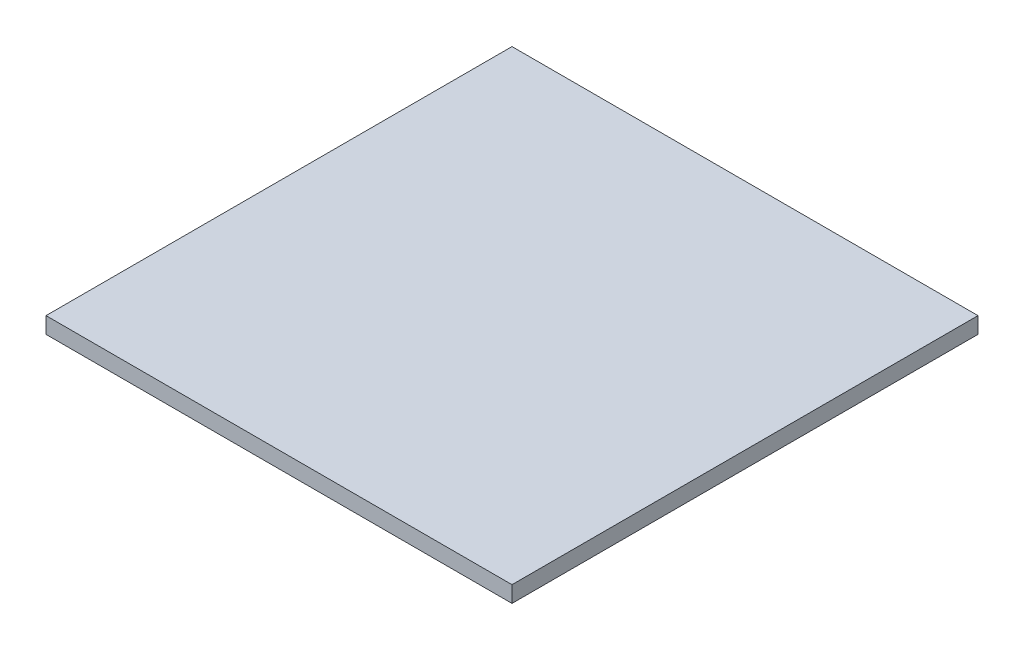
ISO-10303-21;
HEADER;
FILE_DESCRIPTION(('STEP AP214'),'2;1');
FILE_NAME('part.step','',(''),(''),'','','');
FILE_SCHEMA(('AUTOMOTIVE_DESIGN { 1 0 10303 214 1 1 1 1 }'));
ENDSEC;
DATA;
#1=APPLICATION_CONTEXT('core data for automotive mechanical design processes');
#2=APPLICATION_PROTOCOL_DEFINITION('international standard','automotive_design',2000,#1);
#3=PRODUCT_CONTEXT('',#1,'mechanical');
#4=PRODUCT('Part','Part','',(#3));
#5=PRODUCT_RELATED_PRODUCT_CATEGORY('part','',(#4));
#6=PRODUCT_DEFINITION_FORMATION('','',#4);
#7=PRODUCT_DEFINITION_CONTEXT('part definition',#1,'design');
#8=PRODUCT_DEFINITION('design','',#6,#7);
#9=PRODUCT_DEFINITION_SHAPE('','',#8);
#10=(LENGTH_UNIT() NAMED_UNIT(*) SI_UNIT(.MILLI.,.METRE.));
#11=(NAMED_UNIT(*) PLANE_ANGLE_UNIT() SI_UNIT($,.RADIAN.));
#12=(NAMED_UNIT(*) SI_UNIT($,.STERADIAN.) SOLID_ANGLE_UNIT());
#13=UNCERTAINTY_MEASURE_WITH_UNIT(LENGTH_MEASURE(1.E-05),#10,'distance_accuracy_value','');
#14=(GEOMETRIC_REPRESENTATION_CONTEXT(3) GLOBAL_UNCERTAINTY_ASSIGNED_CONTEXT((#13)) GLOBAL_UNIT_ASSIGNED_CONTEXT((#10,
#11,#12)) REPRESENTATION_CONTEXT('',''));
#15=CARTESIAN_POINT('',(0.,0.,0.));
#16=DIRECTION('',(0.,0.,1.));
#17=DIRECTION('',(1.,0.,0.));
#18=AXIS2_PLACEMENT_3D('',#15,#16,#17);
#19=CARTESIAN_POINT('',(-4300.,299.999999999994,4300.));
#20=DIRECTION('',(0.999999999999999,0.,0.));
#21=DIRECTION('',(0.,0.,-0.999999999999999));
#22=AXIS2_PLACEMENT_3D('',#19,#20,#21);
#23=PLANE('',#22);
#24=DIRECTION('',(0.,0.,0.999999999999999));
#25=VECTOR('',#24,1.);
#26=CARTESIAN_POINT('',(-4300.,-4.44089209850063E-12,4300.));
#27=LINE('',#26,#25);
#28=CARTESIAN_POINT('',(-4300.,-5.60662627435704E-12,-4300.));
#29=VERTEX_POINT('',#28);
#30=CARTESIAN_POINT('',(-4300.,-4.44089209850063E-12,4300.));
#31=VERTEX_POINT('',#30);
#32=EDGE_CURVE('E107',#29,#31,#27,.T.);
#33=ORIENTED_EDGE('',*,*,#32,.T.);
#34=DIRECTION('',(0.,-1.,0.));
#35=VECTOR('',#34,1.);
#36=CARTESIAN_POINT('',(-4300.,299.999999999994,4300.));
#37=LINE('',#36,#35);
#38=CARTESIAN_POINT('',(-4300.,299.999999999994,4300.));
#39=VERTEX_POINT('',#38);
#40=EDGE_CURVE('E11',#39,#31,#37,.T.);
#41=ORIENTED_EDGE('',*,*,#40,.F.);
#42=DIRECTION('',(0.,0.,0.999999999999999));
#43=VECTOR('',#42,1.);
#44=CARTESIAN_POINT('',(-4300.,299.999999999994,4300.));
#45=LINE('',#44,#43);
#46=CARTESIAN_POINT('',(-4300.,299.999999999998,-4300.));
#47=VERTEX_POINT('',#46);
#48=EDGE_CURVE('E90',#47,#39,#45,.T.);
#49=ORIENTED_EDGE('',*,*,#48,.F.);
#50=DIRECTION('',(0.,-1.,0.));
#51=VECTOR('',#50,1.);
#52=CARTESIAN_POINT('',(-4300.,299.999999999998,-4300.));
#53=LINE('',#52,#51);
#54=EDGE_CURVE('E103',#47,#29,#53,.T.);
#55=ORIENTED_EDGE('',*,*,#54,.T.);
#56=EDGE_LOOP('',(#33,#41,#49,#55));
#57=FACE_BOUND('',#56,.T.);
#58=ADVANCED_FACE('F38',(#57),#23,.F.);
#59=CARTESIAN_POINT('',(4300.,300.000000000006,4300.));
#60=DIRECTION('',(0.,0.,-1.));
#61=DIRECTION('',(-0.999999999999999,0.,0.));
#62=AXIS2_PLACEMENT_3D('',#59,#60,#61);
#63=PLANE('',#62);
#64=DIRECTION('',(0.999999999999999,0.,0.));
#65=VECTOR('',#64,1.);
#66=CARTESIAN_POINT('',(4300.,6.27276008913213E-12,4300.));
#67=LINE('',#66,#65);
#68=CARTESIAN_POINT('',(4300.,6.27276008913213E-12,4300.));
#69=VERTEX_POINT('',#68);
#70=EDGE_CURVE('E95',#31,#69,#67,.T.);
#71=ORIENTED_EDGE('',*,*,#70,.T.);
#72=DIRECTION('',(0.,-1.,0.));
#73=VECTOR('',#72,1.);
#74=CARTESIAN_POINT('',(4300.,300.000000000006,4300.));
#75=LINE('',#74,#73);
#76=CARTESIAN_POINT('',(4300.,300.000000000006,4300.));
#77=VERTEX_POINT('',#76);
#78=EDGE_CURVE('E47',#77,#69,#75,.T.);
#79=ORIENTED_EDGE('',*,*,#78,.F.);
#80=DIRECTION('',(0.999999999999999,0.,0.));
#81=VECTOR('',#80,1.);
#82=CARTESIAN_POINT('',(4300.,300.000000000006,4300.));
#83=LINE('',#82,#81);
#84=EDGE_CURVE('E85',#39,#77,#83,.T.);
#85=ORIENTED_EDGE('',*,*,#84,.F.);
#86=ORIENTED_EDGE('',*,*,#40,.T.);
#87=EDGE_LOOP('',(#71,#79,#85,#86));
#88=FACE_BOUND('',#87,.T.);
#89=ADVANCED_FACE('F94',(#88),#63,.F.);
#90=CARTESIAN_POINT('',(4300.,300.000000000006,4300.));
#91=DIRECTION('',(-0.999999999999999,0.,0.));
#92=DIRECTION('',(0.,0.,0.999999999999999));
#93=AXIS2_PLACEMENT_3D('',#90,#91,#92);
#94=PLANE('',#93);
#95=DIRECTION('',(0.,0.,-0.999999999999999));
#96=VECTOR('',#95,1.);
#97=CARTESIAN_POINT('',(4300.,6.27276008913213E-12,4300.));
#98=LINE('',#97,#96);
#99=CARTESIAN_POINT('',(4299.99999999999,2.22044604925031E-12,-4299.99999999999));
#100=VERTEX_POINT('',#99);
#101=EDGE_CURVE('E72',#69,#100,#98,.T.);
#102=ORIENTED_EDGE('',*,*,#101,.T.);
#103=DIRECTION('',(0.,-1.,0.));
#104=VECTOR('',#103,1.);
#105=CARTESIAN_POINT('',(4300.,300.000000000002,-4299.99999999999));
#106=LINE('',#105,#104);
#107=CARTESIAN_POINT('',(4300.,300.000000000002,-4299.99999999999));
#108=VERTEX_POINT('',#107);
#109=EDGE_CURVE('E97',#108,#100,#106,.T.);
#110=ORIENTED_EDGE('',*,*,#109,.F.);
#111=DIRECTION('',(0.,0.,-0.999999999999999));
#112=VECTOR('',#111,1.);
#113=CARTESIAN_POINT('',(4300.,300.000000000006,4300.));
#114=LINE('',#113,#112);
#115=EDGE_CURVE('E88',#77,#108,#114,.T.);
#116=ORIENTED_EDGE('',*,*,#115,.F.);
#117=ORIENTED_EDGE('',*,*,#78,.T.);
#118=EDGE_LOOP('',(#102,#110,#116,#117));
#119=FACE_BOUND('',#118,.T.);
#120=ADVANCED_FACE('F98',(#119),#94,.F.);
#121=CARTESIAN_POINT('',(4300.,300.000000000002,-4299.99999999999));
#122=DIRECTION('',(0.,0.,1.));
#123=DIRECTION('',(0.999999999999999,0.,0.));
#124=AXIS2_PLACEMENT_3D('',#121,#122,#123);
#125=PLANE('',#124);
#126=DIRECTION('',(-0.999999999999999,0.,0.));
#127=VECTOR('',#126,1.);
#128=CARTESIAN_POINT('',(4299.99999999999,2.22044604925031E-12,-4299.99999999999));
#129=LINE('',#128,#127);
#130=EDGE_CURVE('E78',#100,#29,#129,.T.);
#131=ORIENTED_EDGE('',*,*,#130,.T.);
#132=ORIENTED_EDGE('',*,*,#54,.F.);
#133=DIRECTION('',(-0.999999999999999,0.,0.));
#134=VECTOR('',#133,1.);
#135=CARTESIAN_POINT('',(4300.,300.000000000002,-4299.99999999999));
#136=LINE('',#135,#134);
#137=EDGE_CURVE('E55',#108,#47,#136,.T.);
#138=ORIENTED_EDGE('',*,*,#137,.F.);
#139=ORIENTED_EDGE('',*,*,#109,.T.);
#140=EDGE_LOOP('',(#131,#132,#138,#139));
#141=FACE_BOUND('',#140,.T.);
#142=ADVANCED_FACE('F121',(#141),#125,.F.);
#143=CARTESIAN_POINT('',(2.77555756156289E-13,300.,4.44089209850063E-13));
#144=DIRECTION('',(0.,1.,0.));
#145=DIRECTION('',(0.,0.,0.999999999999999));
#146=AXIS2_PLACEMENT_3D('',#143,#144,#145);
#147=PLANE('',#146);
#148=ORIENTED_EDGE('',*,*,#48,.T.);
#149=ORIENTED_EDGE('',*,*,#84,.T.);
#150=ORIENTED_EDGE('',*,*,#115,.T.);
#151=ORIENTED_EDGE('',*,*,#137,.T.);
#152=EDGE_LOOP('',(#148,#149,#150,#151));
#153=FACE_BOUND('',#152,.T.);
#154=ADVANCED_FACE('F86',(#153),#147,.T.);
#155=CARTESIAN_POINT('',(0.,0.,0.));
#156=DIRECTION('',(0.,1.,0.));
#157=DIRECTION('',(0.,0.,0.999999999999999));
#158=AXIS2_PLACEMENT_3D('',#155,#156,#157);
#159=PLANE('',#158);
#160=ORIENTED_EDGE('',*,*,#32,.F.);
#161=ORIENTED_EDGE('',*,*,#130,.F.);
#162=ORIENTED_EDGE('',*,*,#101,.F.);
#163=ORIENTED_EDGE('',*,*,#70,.F.);
#164=EDGE_LOOP('',(#160,#161,#162,#163));
#165=FACE_BOUND('',#164,.T.);
#166=ADVANCED_FACE('F124',(#165),#159,.F.);
#167=CLOSED_SHELL('',(#58,#89,#120,#142,#154,#166));
#168=MANIFOLD_SOLID_BREP('B2',#167);
#169=ADVANCED_BREP_SHAPE_REPRESENTATION('',(#18,#168),#14);
#170=SHAPE_DEFINITION_REPRESENTATION(#9,#169);
ENDSEC;
END-ISO-10303-21;
